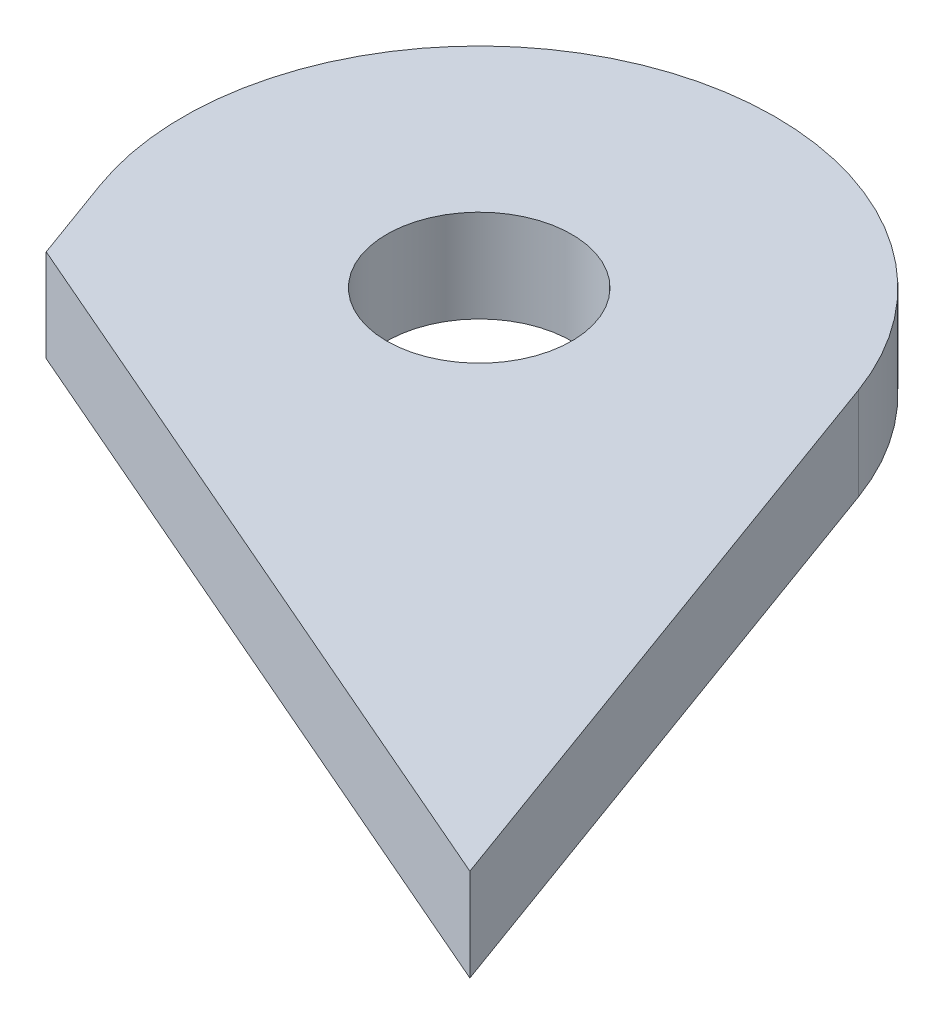
ISO-10303-21;
HEADER;
FILE_DESCRIPTION(('STEP AP214'),'2;1');
FILE_NAME('part.step','',(''),(''),'','','');
FILE_SCHEMA(('AUTOMOTIVE_DESIGN { 1 0 10303 214 1 1 1 1 }'));
ENDSEC;
DATA;
#1=APPLICATION_CONTEXT('core data for automotive mechanical design processes');
#2=APPLICATION_PROTOCOL_DEFINITION('international standard','automotive_design',2000,#1);
#3=PRODUCT_CONTEXT('',#1,'mechanical');
#4=PRODUCT('Part','Part','',(#3));
#5=PRODUCT_RELATED_PRODUCT_CATEGORY('part','',(#4));
#6=PRODUCT_DEFINITION_FORMATION('','',#4);
#7=PRODUCT_DEFINITION_CONTEXT('part definition',#1,'design');
#8=PRODUCT_DEFINITION('design','',#6,#7);
#9=PRODUCT_DEFINITION_SHAPE('','',#8);
#10=(LENGTH_UNIT() NAMED_UNIT(*) SI_UNIT(.MILLI.,.METRE.));
#11=(NAMED_UNIT(*) PLANE_ANGLE_UNIT() SI_UNIT($,.RADIAN.));
#12=(NAMED_UNIT(*) SI_UNIT($,.STERADIAN.) SOLID_ANGLE_UNIT());
#13=UNCERTAINTY_MEASURE_WITH_UNIT(LENGTH_MEASURE(1.E-05),#10,'distance_accuracy_value','');
#14=(GEOMETRIC_REPRESENTATION_CONTEXT(3) GLOBAL_UNCERTAINTY_ASSIGNED_CONTEXT((#13)) GLOBAL_UNIT_ASSIGNED_CONTEXT((#10,
#11,#12)) REPRESENTATION_CONTEXT('',''));
#15=CARTESIAN_POINT('',(0.,0.,0.));
#16=DIRECTION('',(0.,0.,1.));
#17=DIRECTION('',(1.,0.,0.));
#18=AXIS2_PLACEMENT_3D('',#15,#16,#17);
#19=CARTESIAN_POINT('',(0.,6.35,0.));
#20=DIRECTION('',(0.,1.,0.));
#21=DIRECTION('',(0.,0.,1.));
#22=AXIS2_PLACEMENT_3D('',#19,#20,#21);
#23=PLANE('',#22);
#24=CARTESIAN_POINT('',(0.,6.35,0.));
#25=DIRECTION('',(0.,1.,0.));
#26=DIRECTION('',(0.,0.,1.));
#27=AXIS2_PLACEMENT_3D('',#24,#25,#26);
#28=CIRCLE('',#27,20.32);
#29=CARTESIAN_POINT('',(19.0945540543697,6.35,-6.94984931237753));
#30=VERTEX_POINT('',#29);
#31=CARTESIAN_POINT('',(-19.0945540543697,6.35,6.94984931237754));
#32=VERTEX_POINT('',#31);
#33=EDGE_CURVE('E93',#30,#32,#28,.T.);
#34=ORIENTED_EDGE('',*,*,#33,.T.);
#35=DIRECTION('',(0.342020143325666,0.,0.939692620785909));
#36=VECTOR('',#35,1.);
#37=CARTESIAN_POINT('',(-19.0945540543697,6.35,6.94984931237754));
#38=LINE('',#37,#36);
#39=CARTESIAN_POINT('',(-16.9908861663033,6.35,12.7296293328718));
#40=VERTEX_POINT('',#39);
#41=EDGE_CURVE('E88',#32,#40,#38,.T.);
#42=ORIENTED_EDGE('',*,*,#41,.T.);
#43=DIRECTION('',(0.917407699357491,0.,0.397948631307604));
#44=VECTOR('',#43,1.);
#45=CARTESIAN_POINT('',(34.3655094472471,6.35,35.0067558030524));
#46=LINE('',#45,#44);
#47=CARTESIAN_POINT('',(34.3655094472471,6.35,35.0067558030524));
#48=VERTEX_POINT('',#47);
#49=EDGE_CURVE('E91',#40,#48,#46,.T.);
#50=ORIENTED_EDGE('',*,*,#49,.T.);
#51=DIRECTION('',(-0.342020143325666,0.,-0.939692620785909));
#52=VECTOR('',#51,1.);
#53=CARTESIAN_POINT('',(19.0945540543697,6.35,-6.94984931237753));
#54=LINE('',#53,#52);
#55=EDGE_CURVE('E58',#48,#30,#54,.T.);
#56=ORIENTED_EDGE('',*,*,#55,.T.);
#57=EDGE_LOOP('',(#34,#42,#50,#56));
#58=FACE_BOUND('',#57,.T.);
#59=CARTESIAN_POINT('',(0.,6.35,0.));
#60=DIRECTION('',(0.,1.,0.));
#61=DIRECTION('',(0.,0.,1.));
#62=AXIS2_PLACEMENT_3D('',#59,#60,#61);
#63=CIRCLE('',#62,6.35);
#64=CARTESIAN_POINT('',(0.,6.35,6.35));
#65=VERTEX_POINT('',#64);
#66=EDGE_CURVE('E108',#65,#65,#63,.T.);
#67=ORIENTED_EDGE('',*,*,#66,.F.);
#68=EDGE_LOOP('',(#67));
#69=FACE_BOUND('',#68,.T.);
#70=ADVANCED_FACE('F41',(#58,#69),#23,.T.);
#71=CARTESIAN_POINT('',(0.,0.,0.));
#72=DIRECTION('',(0.,1.,0.));
#73=DIRECTION('',(0.,0.,1.));
#74=AXIS2_PLACEMENT_3D('',#71,#72,#73);
#75=PLANE('',#74);
#76=CARTESIAN_POINT('',(0.,0.,0.));
#77=DIRECTION('',(0.,1.,0.));
#78=DIRECTION('',(0.,0.,1.));
#79=AXIS2_PLACEMENT_3D('',#76,#77,#78);
#80=CIRCLE('',#79,20.32);
#81=CARTESIAN_POINT('',(19.0945540543697,0.,-6.94984931237753));
#82=VERTEX_POINT('',#81);
#83=CARTESIAN_POINT('',(-19.0945540543697,0.,6.94984931237754));
#84=VERTEX_POINT('',#83);
#85=EDGE_CURVE('E105',#82,#84,#80,.T.);
#86=ORIENTED_EDGE('',*,*,#85,.F.);
#87=DIRECTION('',(-0.342020143325666,0.,-0.939692620785909));
#88=VECTOR('',#87,1.);
#89=CARTESIAN_POINT('',(19.0945540543697,0.,-6.94984931237753));
#90=LINE('',#89,#88);
#91=CARTESIAN_POINT('',(34.3655094472471,0.,35.0067558030524));
#92=VERTEX_POINT('',#91);
#93=EDGE_CURVE('E81',#92,#82,#90,.T.);
#94=ORIENTED_EDGE('',*,*,#93,.F.);
#95=DIRECTION('',(0.917407699357491,0.,0.397948631307604));
#96=VECTOR('',#95,1.);
#97=CARTESIAN_POINT('',(34.3655094472471,0.,35.0067558030524));
#98=LINE('',#97,#96);
#99=CARTESIAN_POINT('',(-16.9908861663033,0.,12.7296293328718));
#100=VERTEX_POINT('',#99);
#101=EDGE_CURVE('E75',#100,#92,#98,.T.);
#102=ORIENTED_EDGE('',*,*,#101,.F.);
#103=DIRECTION('',(0.342020143325666,0.,0.939692620785909));
#104=VECTOR('',#103,1.);
#105=CARTESIAN_POINT('',(-19.0945540543697,0.,6.94984931237754));
#106=LINE('',#105,#104);
#107=EDGE_CURVE('E97',#84,#100,#106,.T.);
#108=ORIENTED_EDGE('',*,*,#107,.F.);
#109=EDGE_LOOP('',(#86,#94,#102,#108));
#110=FACE_BOUND('',#109,.T.);
#111=CARTESIAN_POINT('',(0.,0.,0.));
#112=DIRECTION('',(0.,1.,0.));
#113=DIRECTION('',(0.,0.,1.));
#114=AXIS2_PLACEMENT_3D('',#111,#112,#113);
#115=CIRCLE('',#114,6.35);
#116=CARTESIAN_POINT('',(0.,0.,6.35));
#117=VERTEX_POINT('',#116);
#118=EDGE_CURVE('E120',#117,#117,#115,.T.);
#119=ORIENTED_EDGE('',*,*,#118,.T.);
#120=EDGE_LOOP('',(#119));
#121=FACE_BOUND('',#120,.T.);
#122=ADVANCED_FACE('F116',(#110,#121),#75,.F.);
#123=CARTESIAN_POINT('',(0.,6.35,0.));
#124=DIRECTION('',(0.,-1.,0.));
#125=DIRECTION('',(0.,0.,-1.));
#126=AXIS2_PLACEMENT_3D('',#123,#124,#125);
#127=CYLINDRICAL_SURFACE('',#126,20.32);
#128=ORIENTED_EDGE('',*,*,#85,.T.);
#129=DIRECTION('',(0.,-1.,0.));
#130=VECTOR('',#129,1.);
#131=CARTESIAN_POINT('',(-19.0945540543697,6.35,6.94984931237754));
#132=LINE('',#131,#130);
#133=EDGE_CURVE('E11',#32,#84,#132,.T.);
#134=ORIENTED_EDGE('',*,*,#133,.F.);
#135=ORIENTED_EDGE('',*,*,#33,.F.);
#136=DIRECTION('',(0.,-1.,0.));
#137=VECTOR('',#136,1.);
#138=CARTESIAN_POINT('',(19.0945540543697,6.35,-6.94984931237753));
#139=LINE('',#138,#137);
#140=EDGE_CURVE('E101',#30,#82,#139,.T.);
#141=ORIENTED_EDGE('',*,*,#140,.T.);
#142=EDGE_LOOP('',(#128,#134,#135,#141));
#143=FACE_BOUND('',#142,.T.);
#144=ADVANCED_FACE('F43',(#143),#127,.T.);
#145=CARTESIAN_POINT('',(-19.0945540543697,6.35,6.94984931237754));
#146=DIRECTION('',(0.939692620785909,0.,-0.342020143325666));
#147=DIRECTION('',(-0.342020143325666,0.,-0.939692620785909));
#148=AXIS2_PLACEMENT_3D('',#145,#146,#147);
#149=PLANE('',#148);
#150=ORIENTED_EDGE('',*,*,#107,.T.);
#151=DIRECTION('',(0.,-1.,0.));
#152=VECTOR('',#151,1.);
#153=CARTESIAN_POINT('',(-16.9908861663033,6.35,12.7296293328718));
#154=LINE('',#153,#152);
#155=EDGE_CURVE('E50',#40,#100,#154,.T.);
#156=ORIENTED_EDGE('',*,*,#155,.F.);
#157=ORIENTED_EDGE('',*,*,#41,.F.);
#158=ORIENTED_EDGE('',*,*,#133,.T.);
#159=EDGE_LOOP('',(#150,#156,#157,#158));
#160=FACE_BOUND('',#159,.T.);
#161=ADVANCED_FACE('F96',(#160),#149,.F.);
#162=CARTESIAN_POINT('',(34.3655094472471,6.35,35.0067558030524));
#163=DIRECTION('',(0.397948631307604,0.,-0.917407699357491));
#164=DIRECTION('',(-0.917407699357491,0.,-0.397948631307604));
#165=AXIS2_PLACEMENT_3D('',#162,#163,#164);
#166=PLANE('',#165);
#167=ORIENTED_EDGE('',*,*,#101,.T.);
#168=DIRECTION('',(0.,-1.,0.));
#169=VECTOR('',#168,1.);
#170=CARTESIAN_POINT('',(34.3655094472471,6.35,35.0067558030524));
#171=LINE('',#170,#169);
#172=EDGE_CURVE('E98',#48,#92,#171,.T.);
#173=ORIENTED_EDGE('',*,*,#172,.F.);
#174=ORIENTED_EDGE('',*,*,#49,.F.);
#175=ORIENTED_EDGE('',*,*,#155,.T.);
#176=EDGE_LOOP('',(#167,#173,#174,#175));
#177=FACE_BOUND('',#176,.T.);
#178=ADVANCED_FACE('F99',(#177),#166,.F.);
#179=CARTESIAN_POINT('',(19.0945540543697,6.35,-6.94984931237753));
#180=DIRECTION('',(-0.939692620785909,0.,0.342020143325666));
#181=DIRECTION('',(0.342020143325666,0.,0.939692620785909));
#182=AXIS2_PLACEMENT_3D('',#179,#180,#181);
#183=PLANE('',#182);
#184=ORIENTED_EDGE('',*,*,#93,.T.);
#185=ORIENTED_EDGE('',*,*,#140,.F.);
#186=ORIENTED_EDGE('',*,*,#55,.F.);
#187=ORIENTED_EDGE('',*,*,#172,.T.);
#188=EDGE_LOOP('',(#184,#185,#186,#187));
#189=FACE_BOUND('',#188,.T.);
#190=ADVANCED_FACE('F113',(#189),#183,.F.);
#191=CARTESIAN_POINT('',(0.,6.35,0.));
#192=DIRECTION('',(0.,-1.,0.));
#193=DIRECTION('',(0.,0.,-1.));
#194=AXIS2_PLACEMENT_3D('',#191,#192,#193);
#195=CYLINDRICAL_SURFACE('',#194,6.35);
#196=ORIENTED_EDGE('',*,*,#66,.T.);
#197=EDGE_LOOP('',(#196));
#198=FACE_BOUND('',#197,.T.);
#199=ORIENTED_EDGE('',*,*,#118,.F.);
#200=EDGE_LOOP('',(#199));
#201=FACE_BOUND('',#200,.T.);
#202=ADVANCED_FACE('F126',(#198,#201),#195,.F.);
#203=CLOSED_SHELL('',(#70,#122,#144,#161,#178,#190,#202));
#204=MANIFOLD_SOLID_BREP('B2',#203);
#205=ADVANCED_BREP_SHAPE_REPRESENTATION('',(#18,#204),#14);
#206=SHAPE_DEFINITION_REPRESENTATION(#9,#205);
ENDSEC;
END-ISO-10303-21;
